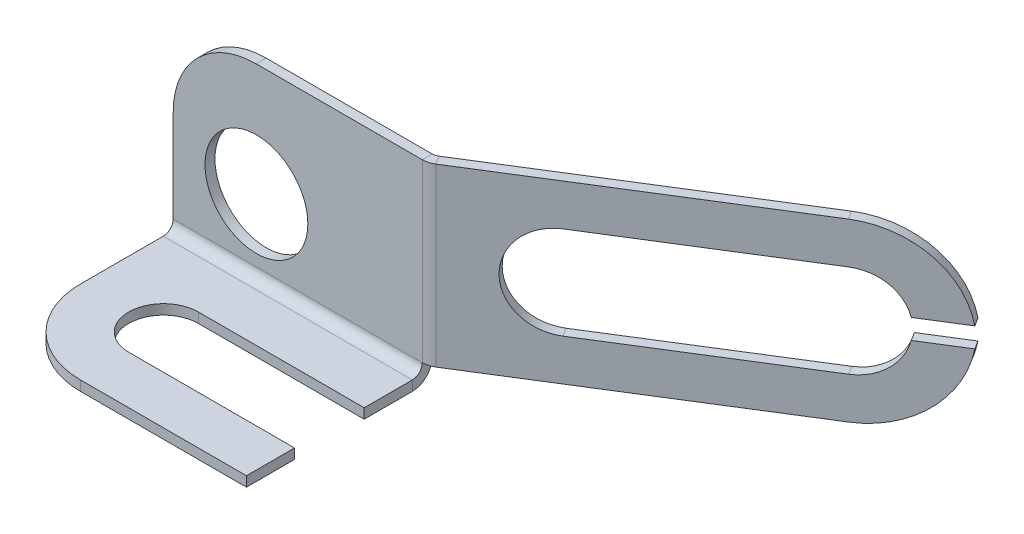
ISO-10303-21;
HEADER;
FILE_DESCRIPTION(('STEP AP214'),'2;1');
FILE_NAME('part.step','',(''),(''),'','','');
FILE_SCHEMA(('AUTOMOTIVE_DESIGN { 1 0 10303 214 1 1 1 1 }'));
ENDSEC;
DATA;
#1=APPLICATION_CONTEXT('core data for automotive mechanical design processes');
#2=APPLICATION_PROTOCOL_DEFINITION('international standard','automotive_design',2000,#1);
#3=PRODUCT_CONTEXT('',#1,'mechanical');
#4=PRODUCT('Part','Part','',(#3));
#5=PRODUCT_RELATED_PRODUCT_CATEGORY('part','',(#4));
#6=PRODUCT_DEFINITION_FORMATION('','',#4);
#7=PRODUCT_DEFINITION_CONTEXT('part definition',#1,'design');
#8=PRODUCT_DEFINITION('design','',#6,#7);
#9=PRODUCT_DEFINITION_SHAPE('','',#8);
#10=(LENGTH_UNIT() NAMED_UNIT(*) SI_UNIT(.MILLI.,.METRE.));
#11=(NAMED_UNIT(*) PLANE_ANGLE_UNIT() SI_UNIT($,.RADIAN.));
#12=(NAMED_UNIT(*) SI_UNIT($,.STERADIAN.) SOLID_ANGLE_UNIT());
#13=UNCERTAINTY_MEASURE_WITH_UNIT(LENGTH_MEASURE(1.E-05),#10,'distance_accuracy_value','');
#14=(GEOMETRIC_REPRESENTATION_CONTEXT(3) GLOBAL_UNCERTAINTY_ASSIGNED_CONTEXT((#13)) GLOBAL_UNIT_ASSIGNED_CONTEXT((#10,
#11,#12)) REPRESENTATION_CONTEXT('',''));
#15=CARTESIAN_POINT('',(0.,0.,0.));
#16=DIRECTION('',(0.,0.,1.));
#17=DIRECTION('',(1.,0.,0.));
#18=AXIS2_PLACEMENT_3D('',#15,#16,#17);
#19=CARTESIAN_POINT('',(17.1963563084559,5.9,-23.8353361754109));
#20=DIRECTION('',(0.5299192642332,0.,0.848048096156429));
#21=DIRECTION('',(0.848048096156429,0.,-0.5299192642332));
#22=AXIS2_PLACEMENT_3D('',#19,#20,#21);
#23=CYLINDRICAL_SURFACE('',#22,2.8);
#24=CARTESIAN_POINT('',(22.4955489507879,5.9,-15.3548552138466));
#25=DIRECTION('',(0.5299192642332,0.,0.848048096156429));
#26=DIRECTION('',(0.848048096156429,0.,-0.5299192642332));
#27=AXIS2_PLACEMENT_3D('',#24,#25,#26);
#28=CIRCLE('',#27,2.8);
#29=CARTESIAN_POINT('',(22.4955489507879,3.1,-15.3548552138466));
#30=VERTEX_POINT('',#29);
#31=CARTESIAN_POINT('',(24.8149256103651,5.3,-16.8041626039501));
#32=VERTEX_POINT('',#31);
#33=EDGE_CURVE('E284',#30,#32,#28,.T.);
#34=ORIENTED_EDGE('',*,*,#33,.T.);
#35=DIRECTION('',(0.5299192642332,0.,0.848048096156429));
#36=VECTOR('',#35,1.);
#37=CARTESIAN_POINT('',(19.5157329680331,5.3,-25.2846435655144));
#38=LINE('',#37,#36);
#39=CARTESIAN_POINT('',(24.4969740518252,5.3,-17.312991461644));
#40=VERTEX_POINT('',#39);
#41=EDGE_CURVE('E485',#40,#32,#38,.T.);
#42=ORIENTED_EDGE('',*,*,#41,.F.);
#43=CARTESIAN_POINT('',(22.177597392248,5.9,-15.8636840715404));
#44=DIRECTION('',(0.5299192642332,0.,0.848048096156429));
#45=DIRECTION('',(0.848048096156429,0.,-0.5299192642332));
#46=AXIS2_PLACEMENT_3D('',#43,#44,#45);
#47=CIRCLE('',#46,2.8);
#48=CARTESIAN_POINT('',(22.177597392248,3.1,-15.8636840715404));
#49=VERTEX_POINT('',#48);
#50=EDGE_CURVE('E462',#49,#40,#47,.T.);
#51=ORIENTED_EDGE('',*,*,#50,.F.);
#52=DIRECTION('',(0.5299192642332,0.,0.848048096156429));
#53=VECTOR('',#52,1.);
#54=CARTESIAN_POINT('',(17.1963563084559,3.1,-23.8353361754109));
#55=LINE('',#54,#53);
#56=EDGE_CURVE('E297',#49,#30,#55,.T.);
#57=ORIENTED_EDGE('',*,*,#56,.T.);
#58=EDGE_LOOP('',(#34,#42,#51,#57));
#59=FACE_BOUND('',#58,.T.);
#60=ADVANCED_FACE('F81',(#59),#23,.F.);
#61=CARTESIAN_POINT('',(27.2376716340272,11.2,-18.3180623415968));
#62=DIRECTION('',(0.,1.,0.));
#63=DIRECTION('',(0.,0.,1.));
#64=AXIS2_PLACEMENT_3D('',#61,#62,#63);
#65=PLANE('',#64);
#66=DIRECTION('',(0.848048096156429,0.,-0.5299192642332));
#67=VECTOR('',#66,1.);
#68=CARTESIAN_POINT('',(27.2376716340272,11.2,-18.3180623415968));
#69=LINE('',#68,#67);
#70=CARTESIAN_POINT('',(7.17632598044222,11.2,-5.78234228461228));
#71=VERTEX_POINT('',#70);
#72=CARTESIAN_POINT('',(22.4886022955512,11.2,-15.3505144618909));
#73=VERTEX_POINT('',#72);
#74=EDGE_CURVE('E304',#71,#73,#69,.T.);
#75=ORIENTED_EDGE('',*,*,#74,.T.);
#76=DIRECTION('',(0.5299192642332,0.,0.848048096156429));
#77=VECTOR('',#76,1.);
#78=CARTESIAN_POINT('',(17.1894096532192,11.2,-23.8309954234552));
#79=LINE('',#78,#77);
#80=CARTESIAN_POINT('',(22.1706507370113,11.2,-15.8593433195847));
#81=VERTEX_POINT('',#80);
#82=EDGE_CURVE('E272',#81,#73,#79,.T.);
#83=ORIENTED_EDGE('',*,*,#82,.F.);
#84=DIRECTION('',(-0.848048096156429,0.,0.5299192642332));
#85=VECTOR('',#84,1.);
#86=CARTESIAN_POINT('',(-0.777569215939798,11.2,-1.51970399011166));
#87=LINE('',#86,#85);
#88=CARTESIAN_POINT('',(6.8583744219023,11.2,-6.29117114230614));
#89=VERTEX_POINT('',#88);
#90=EDGE_CURVE('E308',#89,#81,#87,.F.);
#91=ORIENTED_EDGE('',*,*,#90,.F.);
#92=DIRECTION('',(0.5299192642332,0.,0.848048096156429));
#93=VECTOR('',#92,1.);
#94=CARTESIAN_POINT('',(7.17632598044221,11.2,-5.78234228461229));
#95=LINE('',#94,#93);
#96=EDGE_CURVE('E293',#89,#71,#95,.T.);
#97=ORIENTED_EDGE('',*,*,#96,.T.);
#98=EDGE_LOOP('',(#75,#83,#91,#97));
#99=FACE_BOUND('',#98,.T.);
#100=ADVANCED_FACE('F478',(#99),#65,.T.);
#101=CARTESIAN_POINT('',(-8.47418898798355,0.,-6.2));
#102=DIRECTION('',(-1.,0.,0.));
#103=DIRECTION('',(0.,-1.,0.));
#104=AXIS2_PLACEMENT_3D('',#101,#102,#103);
#105=PLANE('',#104);
#106=DIRECTION('',(0.,1.,0.));
#107=VECTOR('',#106,1.);
#108=CARTESIAN_POINT('',(-8.47418898798355,0.,-5.6));
#109=LINE('',#108,#107);
#110=CARTESIAN_POINT('',(-8.47418898798354,6.2,-5.6));
#111=VERTEX_POINT('',#110);
#112=CARTESIAN_POINT('',(-8.47418898798355,0.599999999999994,-5.6));
#113=VERTEX_POINT('',#112);
#114=EDGE_CURVE('E357',#111,#113,#109,.F.);
#115=ORIENTED_EDGE('',*,*,#114,.F.);
#116=DIRECTION('',(0.,0.,1.));
#117=VECTOR('',#116,1.);
#118=CARTESIAN_POINT('',(-8.47418898798354,6.2,-15.6));
#119=LINE('',#118,#117);
#120=CARTESIAN_POINT('',(-8.47418898798354,6.2,-6.2));
#121=VERTEX_POINT('',#120);
#122=EDGE_CURVE('E341',#121,#111,#119,.T.);
#123=ORIENTED_EDGE('',*,*,#122,.F.);
#124=DIRECTION('',(0.,-1.,0.));
#125=VECTOR('',#124,1.);
#126=CARTESIAN_POINT('',(-8.47418898798355,0.,-6.2));
#127=LINE('',#126,#125);
#128=CARTESIAN_POINT('',(-8.47418898798355,0.600000000000002,-6.2));
#129=VERTEX_POINT('',#128);
#130=EDGE_CURVE('E350',#121,#129,#127,.T.);
#131=ORIENTED_EDGE('',*,*,#130,.T.);
#132=DIRECTION('',(0.,0.,-1.));
#133=VECTOR('',#132,1.);
#134=CARTESIAN_POINT('',(-8.47418898798355,0.599999999999998,-5.6));
#135=LINE('',#134,#133);
#136=EDGE_CURVE('E368',#113,#129,#135,.T.);
#137=ORIENTED_EDGE('',*,*,#136,.F.);
#138=EDGE_LOOP('',(#115,#123,#131,#137));
#139=FACE_BOUND('',#138,.T.);
#140=ADVANCED_FACE('F546',(#139),#105,.T.);
#141=CARTESIAN_POINT('',(6.54042286336237,-0.6,-5.));
#142=DIRECTION('',(1.,0.,0.));
#143=DIRECTION('',(0.,0.,-1.));
#144=AXIS2_PLACEMENT_3D('',#141,#142,#143);
#145=PLANE('',#144);
#146=DIRECTION('',(0.,1.,0.));
#147=VECTOR('',#146,1.);
#148=CARTESIAN_POINT('',(6.54042286336238,-10.,2.1));
#149=LINE('',#148,#147);
#150=CARTESIAN_POINT('',(6.54042286336238,-0.6,2.1));
#151=VERTEX_POINT('',#150);
#152=CARTESIAN_POINT('',(6.54042286336238,0.,2.1));
#153=VERTEX_POINT('',#152);
#154=EDGE_CURVE('E395',#151,#153,#149,.T.);
#155=ORIENTED_EDGE('',*,*,#154,.T.);
#156=DIRECTION('',(0.,0.,-1.));
#157=VECTOR('',#156,1.);
#158=CARTESIAN_POINT('',(6.54042286336237,0.,-5.));
#159=LINE('',#158,#157);
#160=CARTESIAN_POINT('',(6.54042286336238,0.,5.));
#161=VERTEX_POINT('',#160);
#162=EDGE_CURVE('E430',#161,#153,#159,.T.);
#163=ORIENTED_EDGE('',*,*,#162,.F.);
#164=DIRECTION('',(0.,1.,0.));
#165=VECTOR('',#164,1.);
#166=CARTESIAN_POINT('',(6.54042286336238,-0.6,5.));
#167=LINE('',#166,#165);
#168=CARTESIAN_POINT('',(6.54042286336238,-0.6,5.));
#169=VERTEX_POINT('',#168);
#170=EDGE_CURVE('E445',#169,#161,#167,.T.);
#171=ORIENTED_EDGE('',*,*,#170,.F.);
#172=DIRECTION('',(0.,0.,-1.));
#173=VECTOR('',#172,1.);
#174=CARTESIAN_POINT('',(6.54042286336237,-0.6,-5.));
#175=LINE('',#174,#173);
#176=EDGE_CURVE('E413',#169,#151,#175,.T.);
#177=ORIENTED_EDGE('',*,*,#176,.T.);
#178=EDGE_LOOP('',(#155,#163,#171,#177));
#179=FACE_BOUND('',#178,.T.);
#180=ADVANCED_FACE('F581',(#179),#145,.T.);
#181=DIRECTION('',(0.,1.,0.));
#182=VECTOR('',#181,1.);
#183=CARTESIAN_POINT('',(6.54042286336238,-10.,-2.1));
#184=LINE('',#183,#182);
#185=CARTESIAN_POINT('',(6.54042286336238,-0.6,-2.1));
#186=VERTEX_POINT('',#185);
#187=CARTESIAN_POINT('',(6.54042286336238,0.,-2.1));
#188=VERTEX_POINT('',#187);
#189=EDGE_CURVE('E394',#186,#188,#184,.T.);
#190=ORIENTED_EDGE('',*,*,#189,.F.);
#191=CARTESIAN_POINT('',(6.54042286336237,-0.6,-5.));
#192=VERTEX_POINT('',#191);
#193=EDGE_CURVE('E417',#186,#192,#175,.T.);
#194=ORIENTED_EDGE('',*,*,#193,.T.);
#195=DIRECTION('',(0.,1.,0.));
#196=VECTOR('',#195,1.);
#197=CARTESIAN_POINT('',(6.54042286336237,-0.6,-5.));
#198=LINE('',#197,#196);
#199=CARTESIAN_POINT('',(6.54042286336237,0.,-5.));
#200=VERTEX_POINT('',#199);
#201=EDGE_CURVE('E429',#192,#200,#198,.T.);
#202=ORIENTED_EDGE('',*,*,#201,.T.);
#203=EDGE_CURVE('E412',#188,#200,#159,.T.);
#204=ORIENTED_EDGE('',*,*,#203,.F.);
#205=EDGE_LOOP('',(#190,#194,#202,#204));
#206=FACE_BOUND('',#205,.T.);
#207=ADVANCED_FACE('F83',(#206),#145,.T.);
#208=CARTESIAN_POINT('',(-3.47418898798355,-0.6,5.));
#209=DIRECTION('',(0.,0.,1.));
#210=DIRECTION('',(1.,0.,0.));
#211=AXIS2_PLACEMENT_3D('',#208,#209,#210);
#212=PLANE('',#211);
#213=DIRECTION('',(1.,0.,0.));
#214=VECTOR('',#213,1.);
#215=CARTESIAN_POINT('',(-3.47418898798355,0.,5.));
#216=LINE('',#215,#214);
#217=CARTESIAN_POINT('',(-3.47418898798355,0.,5.));
#218=VERTEX_POINT('',#217);
#219=EDGE_CURVE('E442',#218,#161,#216,.T.);
#220=ORIENTED_EDGE('',*,*,#219,.F.);
#221=DIRECTION('',(0.,1.,0.));
#222=VECTOR('',#221,1.);
#223=CARTESIAN_POINT('',(-3.47418898798355,-0.6,5.));
#224=LINE('',#223,#222);
#225=CARTESIAN_POINT('',(-3.47418898798355,-0.6,5.));
#226=VERTEX_POINT('',#225);
#227=EDGE_CURVE('E448',#226,#218,#224,.T.);
#228=ORIENTED_EDGE('',*,*,#227,.F.);
#229=DIRECTION('',(1.,0.,0.));
#230=VECTOR('',#229,1.);
#231=CARTESIAN_POINT('',(-3.47418898798355,-0.6,5.));
#232=LINE('',#231,#230);
#233=EDGE_CURVE('E426',#226,#169,#232,.T.);
#234=ORIENTED_EDGE('',*,*,#233,.T.);
#235=ORIENTED_EDGE('',*,*,#170,.T.);
#236=EDGE_LOOP('',(#220,#228,#234,#235));
#237=FACE_BOUND('',#236,.T.);
#238=ADVANCED_FACE('F585',(#237),#212,.T.);
#239=CARTESIAN_POINT('',(-3.47418898798355,-0.6,0.));
#240=DIRECTION('',(0.,1.,0.));
#241=DIRECTION('',(0.,0.,1.));
#242=AXIS2_PLACEMENT_3D('',#239,#240,#241);
#243=CYLINDRICAL_SURFACE('',#242,5.);
#244=CARTESIAN_POINT('',(-3.47418898798355,0.,0.));
#245=DIRECTION('',(0.,1.,0.));
#246=DIRECTION('',(0.,0.,1.));
#247=AXIS2_PLACEMENT_3D('',#244,#245,#246);
#248=CIRCLE('',#247,5.);
#249=CARTESIAN_POINT('',(-8.47418898798354,0.,0.));
#250=VERTEX_POINT('',#249);
#251=EDGE_CURVE('E439',#250,#218,#248,.T.);
#252=ORIENTED_EDGE('',*,*,#251,.F.);
#253=DIRECTION('',(0.,1.,0.));
#254=VECTOR('',#253,1.);
#255=CARTESIAN_POINT('',(-8.47418898798354,-0.6,0.));
#256=LINE('',#255,#254);
#257=CARTESIAN_POINT('',(-8.47418898798354,-0.6,0.));
#258=VERTEX_POINT('',#257);
#259=EDGE_CURVE('E450',#258,#250,#256,.T.);
#260=ORIENTED_EDGE('',*,*,#259,.F.);
#261=CARTESIAN_POINT('',(-3.47418898798355,-0.6,0.));
#262=DIRECTION('',(0.,1.,0.));
#263=DIRECTION('',(0.,0.,1.));
#264=AXIS2_PLACEMENT_3D('',#261,#262,#263);
#265=CIRCLE('',#264,5.);
#266=EDGE_CURVE('E423',#258,#226,#265,.T.);
#267=ORIENTED_EDGE('',*,*,#266,.T.);
#268=ORIENTED_EDGE('',*,*,#227,.T.);
#269=EDGE_LOOP('',(#252,#260,#267,#268));
#270=FACE_BOUND('',#269,.T.);
#271=ADVANCED_FACE('F590',(#270),#243,.T.);
#272=CARTESIAN_POINT('',(-8.47418898798355,-0.6,-5.));
#273=DIRECTION('',(-1.,0.,0.));
#274=DIRECTION('',(0.,0.,1.));
#275=AXIS2_PLACEMENT_3D('',#272,#273,#274);
#276=PLANE('',#275);
#277=DIRECTION('',(0.,0.,1.));
#278=VECTOR('',#277,1.);
#279=CARTESIAN_POINT('',(-8.47418898798355,0.,-5.));
#280=LINE('',#279,#278);
#281=CARTESIAN_POINT('',(-8.47418898798355,0.,-5.));
#282=VERTEX_POINT('',#281);
#283=EDGE_CURVE('E436',#282,#250,#280,.T.);
#284=ORIENTED_EDGE('',*,*,#283,.F.);
#285=DIRECTION('',(0.,1.,0.));
#286=VECTOR('',#285,1.);
#287=CARTESIAN_POINT('',(-8.47418898798355,-0.6,-5.));
#288=LINE('',#287,#286);
#289=CARTESIAN_POINT('',(-8.47418898798355,-0.600000000000004,-5.));
#290=VERTEX_POINT('',#289);
#291=EDGE_CURVE('E452',#290,#282,#288,.T.);
#292=ORIENTED_EDGE('',*,*,#291,.F.);
#293=DIRECTION('',(0.,0.,1.));
#294=VECTOR('',#293,1.);
#295=CARTESIAN_POINT('',(-8.47418898798355,-0.6,-5.));
#296=LINE('',#295,#294);
#297=EDGE_CURVE('E420',#290,#258,#296,.T.);
#298=ORIENTED_EDGE('',*,*,#297,.T.);
#299=ORIENTED_EDGE('',*,*,#259,.T.);
#300=EDGE_LOOP('',(#284,#292,#298,#299));
#301=FACE_BOUND('',#300,.T.);
#302=ADVANCED_FACE('F588',(#301),#276,.T.);
#303=CARTESIAN_POINT('',(-3.47418898798355,-0.6,0.));
#304=DIRECTION('',(0.,1.,0.));
#305=DIRECTION('',(0.,0.,1.));
#306=AXIS2_PLACEMENT_3D('',#303,#304,#305);
#307=PLANE('',#306);
#308=CARTESIAN_POINT('',(-3.45957713663762,-0.6,0.));
#309=DIRECTION('',(0.,1.,0.));
#310=DIRECTION('',(0.,0.,1.));
#311=AXIS2_PLACEMENT_3D('',#308,#309,#310);
#312=CIRCLE('',#311,2.1);
#313=CARTESIAN_POINT('',(-3.45957713663762,-0.6,-2.1));
#314=VERTEX_POINT('',#313);
#315=CARTESIAN_POINT('',(-3.45957713663762,-0.6,2.1));
#316=VERTEX_POINT('',#315);
#317=EDGE_CURVE('E406',#314,#316,#312,.T.);
#318=ORIENTED_EDGE('',*,*,#317,.T.);
#319=DIRECTION('',(1.,0.,0.));
#320=VECTOR('',#319,1.);
#321=CARTESIAN_POINT('',(-3.47418898798355,-0.6,2.1));
#322=LINE('',#321,#320);
#323=EDGE_CURVE('E409',#316,#151,#322,.T.);
#324=ORIENTED_EDGE('',*,*,#323,.T.);
#325=ORIENTED_EDGE('',*,*,#176,.F.);
#326=ORIENTED_EDGE('',*,*,#233,.F.);
#327=ORIENTED_EDGE('',*,*,#266,.F.);
#328=ORIENTED_EDGE('',*,*,#297,.F.);
#329=DIRECTION('',(-1.,0.,0.));
#330=VECTOR('',#329,1.);
#331=CARTESIAN_POINT('',(-8.47418898798355,-0.6,-5.));
#332=LINE('',#331,#330);
#333=EDGE_CURVE('E416',#192,#290,#332,.T.);
#334=ORIENTED_EDGE('',*,*,#333,.F.);
#335=ORIENTED_EDGE('',*,*,#193,.F.);
#336=DIRECTION('',(-1.,0.,0.));
#337=VECTOR('',#336,1.);
#338=CARTESIAN_POINT('',(-3.47418898798355,-0.6,-2.1));
#339=LINE('',#338,#337);
#340=EDGE_CURVE('E398',#186,#314,#339,.T.);
#341=ORIENTED_EDGE('',*,*,#340,.T.);
#342=EDGE_LOOP('',(#318,#324,#325,#326,#327,#328,#334,#335,#341));
#343=FACE_BOUND('',#342,.T.);
#344=ADVANCED_FACE('F560',(#343),#307,.F.);
#345=CARTESIAN_POINT('',(-3.47418898798355,0.,0.));
#346=DIRECTION('',(0.,1.,0.));
#347=DIRECTION('',(0.,0.,1.));
#348=AXIS2_PLACEMENT_3D('',#345,#346,#347);
#349=PLANE('',#348);
#350=DIRECTION('',(1.,0.,0.));
#351=VECTOR('',#350,1.);
#352=CARTESIAN_POINT('',(6.54042286336238,0.,2.1));
#353=LINE('',#352,#351);
#354=CARTESIAN_POINT('',(-3.45957713663762,0.,2.1));
#355=VERTEX_POINT('',#354);
#356=EDGE_CURVE('E392',#355,#153,#353,.T.);
#357=ORIENTED_EDGE('',*,*,#356,.F.);
#358=CARTESIAN_POINT('',(-3.45957713663762,0.,0.));
#359=DIRECTION('',(0.,1.,0.));
#360=DIRECTION('',(0.,0.,1.));
#361=AXIS2_PLACEMENT_3D('',#358,#359,#360);
#362=CIRCLE('',#361,2.1);
#363=CARTESIAN_POINT('',(-3.45957713663762,0.,-2.1));
#364=VERTEX_POINT('',#363);
#365=EDGE_CURVE('E389',#364,#355,#362,.T.);
#366=ORIENTED_EDGE('',*,*,#365,.F.);
#367=DIRECTION('',(-1.,0.,0.));
#368=VECTOR('',#367,1.);
#369=CARTESIAN_POINT('',(6.54042286336238,0.,-2.1));
#370=LINE('',#369,#368);
#371=EDGE_CURVE('E378',#188,#364,#370,.T.);
#372=ORIENTED_EDGE('',*,*,#371,.F.);
#373=ORIENTED_EDGE('',*,*,#203,.T.);
#374=DIRECTION('',(-1.,0.,0.));
#375=VECTOR('',#374,1.);
#376=CARTESIAN_POINT('',(-8.47418898798355,0.,-5.));
#377=LINE('',#376,#375);
#378=EDGE_CURVE('E433',#200,#282,#377,.T.);
#379=ORIENTED_EDGE('',*,*,#378,.T.);
#380=ORIENTED_EDGE('',*,*,#283,.T.);
#381=ORIENTED_EDGE('',*,*,#251,.T.);
#382=ORIENTED_EDGE('',*,*,#219,.T.);
#383=ORIENTED_EDGE('',*,*,#162,.T.);
#384=EDGE_LOOP('',(#357,#366,#372,#373,#379,#380,#381,#382,#383));
#385=FACE_BOUND('',#384,.T.);
#386=ADVANCED_FACE('F573',(#385),#349,.T.);
#387=CARTESIAN_POINT('',(6.54042286336238,-10.,2.1));
#388=DIRECTION('',(0.,0.,1.));
#389=DIRECTION('',(1.,0.,0.));
#390=AXIS2_PLACEMENT_3D('',#387,#388,#389);
#391=PLANE('',#390);
#392=DIRECTION('',(0.,1.,0.));
#393=VECTOR('',#392,1.);
#394=CARTESIAN_POINT('',(-3.45957713663762,-10.,2.1));
#395=LINE('',#394,#393);
#396=EDGE_CURVE('E399',#316,#355,#395,.T.);
#397=ORIENTED_EDGE('',*,*,#396,.T.);
#398=ORIENTED_EDGE('',*,*,#356,.T.);
#399=ORIENTED_EDGE('',*,*,#154,.F.);
#400=ORIENTED_EDGE('',*,*,#323,.F.);
#401=EDGE_LOOP('',(#397,#398,#399,#400));
#402=FACE_BOUND('',#401,.T.);
#403=ADVANCED_FACE('F901',(#402),#391,.F.);
#404=CARTESIAN_POINT('',(-3.45957713663762,-10.,0.));
#405=DIRECTION('',(0.,1.,0.));
#406=DIRECTION('',(0.,0.,1.));
#407=AXIS2_PLACEMENT_3D('',#404,#405,#406);
#408=CYLINDRICAL_SURFACE('',#407,2.1);
#409=DIRECTION('',(0.,1.,0.));
#410=VECTOR('',#409,1.);
#411=CARTESIAN_POINT('',(-3.45957713663762,-10.,-2.1));
#412=LINE('',#411,#410);
#413=EDGE_CURVE('E401',#314,#364,#412,.T.);
#414=ORIENTED_EDGE('',*,*,#413,.T.);
#415=ORIENTED_EDGE('',*,*,#365,.T.);
#416=ORIENTED_EDGE('',*,*,#396,.F.);
#417=ORIENTED_EDGE('',*,*,#317,.F.);
#418=EDGE_LOOP('',(#414,#415,#416,#417));
#419=FACE_BOUND('',#418,.T.);
#420=ADVANCED_FACE('F576',(#419),#408,.F.);
#421=CARTESIAN_POINT('',(6.54042286336238,-10.,-2.1));
#422=DIRECTION('',(0.,0.,-1.));
#423=DIRECTION('',(-1.,0.,0.));
#424=AXIS2_PLACEMENT_3D('',#421,#422,#423);
#425=PLANE('',#424);
#426=ORIENTED_EDGE('',*,*,#189,.T.);
#427=ORIENTED_EDGE('',*,*,#371,.T.);
#428=ORIENTED_EDGE('',*,*,#413,.F.);
#429=ORIENTED_EDGE('',*,*,#340,.F.);
#430=EDGE_LOOP('',(#426,#427,#428,#429));
#431=FACE_BOUND('',#430,.T.);
#432=ADVANCED_FACE('F568',(#431),#425,.F.);
#433=CARTESIAN_POINT('',(6.54042286336237,0.599999999999994,-5.));
#434=DIRECTION('',(1.,0.,0.));
#435=DIRECTION('',(0.,0.,-1.));
#436=AXIS2_PLACEMENT_3D('',#433,#434,#435);
#437=PLANE('',#436);
#438=DIRECTION('',(0.,0.,-1.));
#439=VECTOR('',#438,1.);
#440=CARTESIAN_POINT('',(6.54042286336237,0.600000000000002,-6.20000000000007));
#441=LINE('',#440,#439);
#442=CARTESIAN_POINT('',(6.54042286336237,0.599999999999993,-5.6));
#443=VERTEX_POINT('',#442);
#444=CARTESIAN_POINT('',(6.54042286336237,0.599999999999993,-6.2));
#445=VERTEX_POINT('',#444);
#446=EDGE_CURVE('E345',#443,#445,#441,.T.);
#447=ORIENTED_EDGE('',*,*,#446,.F.);
#448=CARTESIAN_POINT('',(6.54042286336237,0.599999999999994,-5.));
#449=DIRECTION('',(-1.,0.,0.));
#450=DIRECTION('',(0.,0.,1.));
#451=AXIS2_PLACEMENT_3D('',#448,#449,#450);
#452=CIRCLE('',#451,0.599999999999998);
#453=EDGE_CURVE('E382',#200,#443,#452,.F.);
#454=ORIENTED_EDGE('',*,*,#453,.F.);
#455=ORIENTED_EDGE('',*,*,#201,.F.);
#456=CARTESIAN_POINT('',(6.54042286336237,0.599999999999994,-5.));
#457=DIRECTION('',(-1.,0.,0.));
#458=DIRECTION('',(0.,0.,1.));
#459=AXIS2_PLACEMENT_3D('',#456,#457,#458);
#460=CIRCLE('',#459,1.2);
#461=EDGE_CURVE('E375',#192,#445,#460,.F.);
#462=ORIENTED_EDGE('',*,*,#461,.T.);
#463=EDGE_LOOP('',(#447,#454,#455,#462));
#464=FACE_BOUND('',#463,.T.);
#465=ADVANCED_FACE('F529',(#464),#437,.T.);
#466=CARTESIAN_POINT('',(-8.47418898798355,0.599999999999994,-5.));
#467=DIRECTION('',(1.,0.,0.));
#468=DIRECTION('',(0.,0.,-1.));
#469=AXIS2_PLACEMENT_3D('',#466,#467,#468);
#470=PLANE('',#469);
#471=CARTESIAN_POINT('',(-8.47418898798355,0.599999999999994,-5.));
#472=DIRECTION('',(-1.,0.,0.));
#473=DIRECTION('',(0.,0.,1.));
#474=AXIS2_PLACEMENT_3D('',#471,#472,#473);
#475=CIRCLE('',#474,0.599999999999998);
#476=EDGE_CURVE('E349',#113,#282,#475,.T.);
#477=ORIENTED_EDGE('',*,*,#476,.F.);
#478=ORIENTED_EDGE('',*,*,#136,.T.);
#479=CARTESIAN_POINT('',(-8.47418898798355,0.599999999999994,-5.));
#480=DIRECTION('',(-1.,0.,0.));
#481=DIRECTION('',(0.,0.,1.));
#482=AXIS2_PLACEMENT_3D('',#479,#480,#481);
#483=CIRCLE('',#482,1.2);
#484=EDGE_CURVE('E379',#129,#290,#483,.T.);
#485=ORIENTED_EDGE('',*,*,#484,.T.);
#486=ORIENTED_EDGE('',*,*,#291,.T.);
#487=EDGE_LOOP('',(#477,#478,#485,#486));
#488=FACE_BOUND('',#487,.T.);
#489=ADVANCED_FACE('F550',(#488),#470,.F.);
#490=CARTESIAN_POINT('',(-8.47418898798355,0.599999999999994,-5.));
#491=DIRECTION('',(-1.,0.,0.));
#492=DIRECTION('',(0.,0.,-1.));
#493=AXIS2_PLACEMENT_3D('',#490,#491,#492);
#494=CYLINDRICAL_SURFACE('',#493,1.2);
#495=ORIENTED_EDGE('',*,*,#333,.T.);
#496=ORIENTED_EDGE('',*,*,#484,.F.);
#497=DIRECTION('',(-1.,0.,0.));
#498=VECTOR('',#497,1.);
#499=CARTESIAN_POINT('',(0.,0.600000000000002,-6.2));
#500=LINE('',#499,#498);
#501=EDGE_CURVE('E365',#445,#129,#500,.T.);
#502=ORIENTED_EDGE('',*,*,#501,.F.);
#503=ORIENTED_EDGE('',*,*,#461,.F.);
#504=EDGE_LOOP('',(#495,#496,#502,#503));
#505=FACE_BOUND('',#504,.T.);
#506=ADVANCED_FACE('F556',(#505),#494,.T.);
#507=CARTESIAN_POINT('',(-8.47418898798355,0.599999999999994,-5.));
#508=DIRECTION('',(-1.,0.,0.));
#509=DIRECTION('',(0.,0.,-1.));
#510=AXIS2_PLACEMENT_3D('',#507,#508,#509);
#511=CYLINDRICAL_SURFACE('',#510,0.599999999999998);
#512=ORIENTED_EDGE('',*,*,#378,.F.);
#513=ORIENTED_EDGE('',*,*,#453,.T.);
#514=DIRECTION('',(1.,0.,0.));
#515=VECTOR('',#514,1.);
#516=CARTESIAN_POINT('',(6.54042286336238,0.599999999999998,-5.6));
#517=LINE('',#516,#515);
#518=EDGE_CURVE('E371',#443,#113,#517,.F.);
#519=ORIENTED_EDGE('',*,*,#518,.T.);
#520=ORIENTED_EDGE('',*,*,#476,.T.);
#521=EDGE_LOOP('',(#512,#513,#519,#520));
#522=FACE_BOUND('',#521,.T.);
#523=ADVANCED_FACE('F536',(#522),#511,.F.);
#524=CARTESIAN_POINT('',(0.,0.,-6.2));
#525=DIRECTION('',(0.,0.,-1.));
#526=DIRECTION('',(-1.,0.,0.));
#527=AXIS2_PLACEMENT_3D('',#524,#525,#526);
#528=PLANE('',#527);
#529=CARTESIAN_POINT('',(-3.45957713663763,4.4,-6.2));
#530=DIRECTION('',(0.,0.,-1.));
#531=DIRECTION('',(-1.,0.,0.));
#532=AXIS2_PLACEMENT_3D('',#529,#530,#531);
#533=CIRCLE('',#532,3.1);
#534=CARTESIAN_POINT('',(-6.55957713663763,4.4,-6.2));
#535=VERTEX_POINT('',#534);
#536=EDGE_CURVE('E336',#535,#535,#533,.T.);
#537=ORIENTED_EDGE('',*,*,#536,.F.);
#538=EDGE_LOOP('',(#537));
#539=FACE_BOUND('',#538,.T.);
#540=CARTESIAN_POINT('',(-3.47418898798354,6.2,-6.2));
#541=DIRECTION('',(0.,0.,-1.));
#542=DIRECTION('',(-1.,0.,0.));
#543=AXIS2_PLACEMENT_3D('',#540,#541,#542);
#544=CIRCLE('',#543,5.);
#545=CARTESIAN_POINT('',(-3.47418898798354,11.2,-6.2));
#546=VERTEX_POINT('',#545);
#547=EDGE_CURVE('E343',#546,#121,#544,.F.);
#548=ORIENTED_EDGE('',*,*,#547,.F.);
#549=DIRECTION('',(-1.,0.,0.));
#550=VECTOR('',#549,1.);
#551=CARTESIAN_POINT('',(-8.47418898798354,11.2,-6.2));
#552=LINE('',#551,#550);
#553=CARTESIAN_POINT('',(6.54042286336237,11.2,-6.2));
#554=VERTEX_POINT('',#553);
#555=EDGE_CURVE('E352',#554,#546,#552,.T.);
#556=ORIENTED_EDGE('',*,*,#555,.F.);
#557=DIRECTION('',(0.,1.,0.));
#558=VECTOR('',#557,1.);
#559=CARTESIAN_POINT('',(6.54042286336238,11.2,-6.2));
#560=LINE('',#559,#558);
#561=EDGE_CURVE('E355',#445,#554,#560,.T.);
#562=ORIENTED_EDGE('',*,*,#561,.F.);
#563=ORIENTED_EDGE('',*,*,#501,.T.);
#564=ORIENTED_EDGE('',*,*,#130,.F.);
#565=EDGE_LOOP('',(#548,#556,#562,#563,#564));
#566=FACE_BOUND('',#565,.T.);
#567=ADVANCED_FACE('F553',(#539,#566),#528,.T.);
#568=CARTESIAN_POINT('',(0.,0.,-5.6));
#569=DIRECTION('',(0.,0.,-1.));
#570=DIRECTION('',(-1.,0.,0.));
#571=AXIS2_PLACEMENT_3D('',#568,#569,#570);
#572=PLANE('',#571);
#573=CARTESIAN_POINT('',(-3.45957713663763,4.4,-5.6));
#574=DIRECTION('',(0.,0.,1.));
#575=DIRECTION('',(1.,0.,0.));
#576=AXIS2_PLACEMENT_3D('',#573,#574,#575);
#577=CIRCLE('',#576,3.1);
#578=CARTESIAN_POINT('',(-0.359577136637625,4.4,-5.6));
#579=VERTEX_POINT('',#578);
#580=EDGE_CURVE('E325',#579,#579,#577,.T.);
#581=ORIENTED_EDGE('',*,*,#580,.F.);
#582=EDGE_LOOP('',(#581));
#583=FACE_BOUND('',#582,.T.);
#584=DIRECTION('',(1.,0.,0.));
#585=VECTOR('',#584,1.);
#586=CARTESIAN_POINT('',(0.,11.2,-5.6));
#587=LINE('',#586,#585);
#588=CARTESIAN_POINT('',(6.54042286336238,11.2,-5.6));
#589=VERTEX_POINT('',#588);
#590=CARTESIAN_POINT('',(-3.47418898798354,11.2,-5.6));
#591=VERTEX_POINT('',#590);
#592=EDGE_CURVE('E359',#589,#591,#587,.F.);
#593=ORIENTED_EDGE('',*,*,#592,.T.);
#594=CARTESIAN_POINT('',(-3.47418898798354,6.2,-5.6));
#595=DIRECTION('',(0.,0.,-1.));
#596=DIRECTION('',(-1.,0.,0.));
#597=AXIS2_PLACEMENT_3D('',#594,#595,#596);
#598=CIRCLE('',#597,5.);
#599=EDGE_CURVE('E339',#111,#591,#598,.T.);
#600=ORIENTED_EDGE('',*,*,#599,.F.);
#601=ORIENTED_EDGE('',*,*,#114,.T.);
#602=ORIENTED_EDGE('',*,*,#518,.F.);
#603=DIRECTION('',(0.,-1.,0.));
#604=VECTOR('',#603,1.);
#605=CARTESIAN_POINT('',(6.54042286336237,0.,-5.6));
#606=LINE('',#605,#604);
#607=EDGE_CURVE('E362',#443,#589,#606,.F.);
#608=ORIENTED_EDGE('',*,*,#607,.T.);
#609=EDGE_LOOP('',(#593,#600,#601,#602,#608));
#610=FACE_BOUND('',#609,.T.);
#611=ADVANCED_FACE('F539',(#583,#610),#572,.F.);
#612=CARTESIAN_POINT('',(-8.47418898798354,11.2,-6.2));
#613=DIRECTION('',(0.,1.,0.));
#614=DIRECTION('',(0.,0.,1.));
#615=AXIS2_PLACEMENT_3D('',#612,#613,#614);
#616=PLANE('',#615);
#617=DIRECTION('',(0.,0.,1.));
#618=VECTOR('',#617,1.);
#619=CARTESIAN_POINT('',(-3.47418898798354,11.2,-15.6));
#620=LINE('',#619,#618);
#621=EDGE_CURVE('E447',#591,#546,#620,.F.);
#622=ORIENTED_EDGE('',*,*,#621,.F.);
#623=ORIENTED_EDGE('',*,*,#592,.F.);
#624=DIRECTION('',(0.,0.,1.));
#625=VECTOR('',#624,1.);
#626=CARTESIAN_POINT('',(6.54042286336238,11.2,-6.2));
#627=LINE('',#626,#625);
#628=EDGE_CURVE('E346',#554,#589,#627,.T.);
#629=ORIENTED_EDGE('',*,*,#628,.F.);
#630=ORIENTED_EDGE('',*,*,#555,.T.);
#631=EDGE_LOOP('',(#622,#623,#629,#630));
#632=FACE_BOUND('',#631,.T.);
#633=ADVANCED_FACE('F797',(#632),#616,.T.);
#634=CARTESIAN_POINT('',(-3.47418898798354,6.2,-15.6));
#635=DIRECTION('',(0.,0.,1.));
#636=DIRECTION('',(1.,0.,0.));
#637=AXIS2_PLACEMENT_3D('',#634,#635,#636);
#638=CYLINDRICAL_SURFACE('',#637,5.);
#639=ORIENTED_EDGE('',*,*,#547,.T.);
#640=ORIENTED_EDGE('',*,*,#122,.T.);
#641=ORIENTED_EDGE('',*,*,#599,.T.);
#642=ORIENTED_EDGE('',*,*,#621,.T.);
#643=EDGE_LOOP('',(#639,#640,#641,#642));
#644=FACE_BOUND('',#643,.T.);
#645=ADVANCED_FACE('F784',(#644),#638,.T.);
#646=CARTESIAN_POINT('',(-3.45957713663763,4.4,-15.6));
#647=DIRECTION('',(0.,0.,1.));
#648=DIRECTION('',(1.,0.,0.));
#649=AXIS2_PLACEMENT_3D('',#646,#647,#648);
#650=CYLINDRICAL_SURFACE('',#649,3.1);
#651=ORIENTED_EDGE('',*,*,#536,.T.);
#652=EDGE_LOOP('',(#651));
#653=FACE_BOUND('',#652,.T.);
#654=ORIENTED_EDGE('',*,*,#580,.T.);
#655=EDGE_LOOP('',(#654));
#656=FACE_BOUND('',#655,.T.);
#657=ADVANCED_FACE('F771',(#653,#656),#650,.F.);
#658=CARTESIAN_POINT('',(6.54042286336238,11.2,-6.8));
#659=DIRECTION('',(0.,1.,0.));
#660=DIRECTION('',(0.,0.,1.));
#661=AXIS2_PLACEMENT_3D('',#658,#659,#660);
#662=PLANE('',#661);
#663=ORIENTED_EDGE('',*,*,#96,.F.);
#664=CARTESIAN_POINT('',(6.54042286336238,11.2,-6.8));
#665=DIRECTION('',(0.,-1.,0.));
#666=DIRECTION('',(0.,0.,-1.));
#667=AXIS2_PLACEMENT_3D('',#664,#665,#666);
#668=CIRCLE('',#667,0.600000000000002);
#669=EDGE_CURVE('E329',#554,#89,#668,.F.);
#670=ORIENTED_EDGE('',*,*,#669,.F.);
#671=ORIENTED_EDGE('',*,*,#628,.T.);
#672=CARTESIAN_POINT('',(6.54042286336238,11.2,-6.8));
#673=DIRECTION('',(0.,-1.,0.));
#674=DIRECTION('',(0.,0.,-1.));
#675=AXIS2_PLACEMENT_3D('',#672,#673,#674);
#676=CIRCLE('',#675,1.2);
#677=EDGE_CURVE('E322',#589,#71,#676,.F.);
#678=ORIENTED_EDGE('',*,*,#677,.T.);
#679=EDGE_LOOP('',(#663,#670,#671,#678));
#680=FACE_BOUND('',#679,.T.);
#681=ADVANCED_FACE('F760',(#680),#662,.T.);
#682=CARTESIAN_POINT('',(6.54042286336238,0.599999999999993,-6.80000000000001));
#683=DIRECTION('',(0.,1.,0.));
#684=DIRECTION('',(0.,0.,1.));
#685=AXIS2_PLACEMENT_3D('',#682,#683,#684);
#686=PLANE('',#685);
#687=CARTESIAN_POINT('',(6.54042286336238,0.599999999999993,-6.80000000000001));
#688=DIRECTION('',(0.,-1.,0.));
#689=DIRECTION('',(0.,0.,-1.));
#690=AXIS2_PLACEMENT_3D('',#687,#688,#689);
#691=CIRCLE('',#690,0.600000000000002);
#692=CARTESIAN_POINT('',(6.8583744219023,0.599999999999993,-6.29117114230615));
#693=VERTEX_POINT('',#692);
#694=EDGE_CURVE('E303',#693,#445,#691,.T.);
#695=ORIENTED_EDGE('',*,*,#694,.F.);
#696=DIRECTION('',(0.5299192642332,0.,0.848048096156429));
#697=VECTOR('',#696,1.);
#698=CARTESIAN_POINT('',(6.8583744219023,0.599999999999993,-6.29117114230614));
#699=LINE('',#698,#697);
#700=CARTESIAN_POINT('',(7.17632598044222,0.599999999999993,-5.78234228461229));
#701=VERTEX_POINT('',#700);
#702=EDGE_CURVE('E314',#693,#701,#699,.T.);
#703=ORIENTED_EDGE('',*,*,#702,.T.);
#704=CARTESIAN_POINT('',(6.54042286336238,0.599999999999993,-6.80000000000001));
#705=DIRECTION('',(0.,-1.,0.));
#706=DIRECTION('',(0.,0.,-1.));
#707=AXIS2_PLACEMENT_3D('',#704,#705,#706);
#708=CIRCLE('',#707,1.2);
#709=EDGE_CURVE('E326',#701,#443,#708,.T.);
#710=ORIENTED_EDGE('',*,*,#709,.T.);
#711=ORIENTED_EDGE('',*,*,#446,.T.);
#712=EDGE_LOOP('',(#695,#703,#710,#711));
#713=FACE_BOUND('',#712,.T.);
#714=ADVANCED_FACE('F524',(#713),#686,.F.);
#715=CARTESIAN_POINT('',(6.54042286336238,0.599999999999995,-6.80000000000001));
#716=DIRECTION('',(0.,-1.,0.));
#717=DIRECTION('',(0.5299192642332,0.,0.848048096156429));
#718=AXIS2_PLACEMENT_3D('',#715,#716,#717);
#719=CYLINDRICAL_SURFACE('',#718,1.2);
#720=ORIENTED_EDGE('',*,*,#607,.F.);
#721=ORIENTED_EDGE('',*,*,#709,.F.);
#722=DIRECTION('',(0.,-1.,0.));
#723=VECTOR('',#722,1.);
#724=CARTESIAN_POINT('',(7.17632598044222,0.,-5.78234228461229));
#725=LINE('',#724,#723);
#726=EDGE_CURVE('E311',#71,#701,#725,.T.);
#727=ORIENTED_EDGE('',*,*,#726,.F.);
#728=ORIENTED_EDGE('',*,*,#677,.F.);
#729=EDGE_LOOP('',(#720,#721,#727,#728));
#730=FACE_BOUND('',#729,.T.);
#731=ADVANCED_FACE('F738',(#730),#719,.T.);
#732=CARTESIAN_POINT('',(6.54042286336238,0.599999999999995,-6.80000000000001));
#733=DIRECTION('',(0.,-1.,0.));
#734=DIRECTION('',(0.5299192642332,0.,0.848048096156429));
#735=AXIS2_PLACEMENT_3D('',#732,#733,#734);
#736=CYLINDRICAL_SURFACE('',#735,0.600000000000002);
#737=ORIENTED_EDGE('',*,*,#561,.T.);
#738=ORIENTED_EDGE('',*,*,#669,.T.);
#739=DIRECTION('',(0.,1.,0.));
#740=VECTOR('',#739,1.);
#741=CARTESIAN_POINT('',(6.8583744219023,11.2,-6.29117114230614));
#742=LINE('',#741,#740);
#743=EDGE_CURVE('E317',#89,#693,#742,.F.);
#744=ORIENTED_EDGE('',*,*,#743,.T.);
#745=ORIENTED_EDGE('',*,*,#694,.T.);
#746=EDGE_LOOP('',(#737,#738,#744,#745));
#747=FACE_BOUND('',#746,.T.);
#748=ADVANCED_FACE('F520',(#747),#736,.F.);
#749=CARTESIAN_POINT('',(7.03042165335758,0.599999999999993,-5.69117114230614));
#750=DIRECTION('',(0.,-1.,0.));
#751=DIRECTION('',(1.,0.,0.));
#752=AXIS2_PLACEMENT_3D('',#749,#750,#751);
#753=PLANE('',#752);
#754=DIRECTION('',(0.5299192642332,0.,0.848048096156429));
#755=VECTOR('',#754,1.);
#756=CARTESIAN_POINT('',(17.1894096532192,0.599999999999992,-23.8309954234552));
#757=LINE('',#756,#755);
#758=CARTESIAN_POINT('',(22.1706507370113,0.59999999999999,-15.8593433195847));
#759=VERTEX_POINT('',#758);
#760=CARTESIAN_POINT('',(22.4886022955512,0.59999999999999,-15.3505144618909));
#761=VERTEX_POINT('',#760);
#762=EDGE_CURVE('E278',#759,#761,#757,.T.);
#763=ORIENTED_EDGE('',*,*,#762,.T.);
#764=DIRECTION('',(-0.848048096156429,0.,0.5299192642332));
#765=VECTOR('',#764,1.);
#766=CARTESIAN_POINT('',(7.03042165335758,0.599999999999993,-5.69117114230614));
#767=LINE('',#766,#765);
#768=EDGE_CURVE('E301',#761,#701,#767,.T.);
#769=ORIENTED_EDGE('',*,*,#768,.T.);
#770=ORIENTED_EDGE('',*,*,#702,.F.);
#771=DIRECTION('',(0.848048096156429,0.,-0.5299192642332));
#772=VECTOR('',#771,1.);
#773=CARTESIAN_POINT('',(-0.777569215939799,0.599999999999994,-1.51970399011166));
#774=LINE('',#773,#772);
#775=EDGE_CURVE('E306',#759,#693,#774,.F.);
#776=ORIENTED_EDGE('',*,*,#775,.F.);
#777=EDGE_LOOP('',(#763,#769,#770,#776));
#778=FACE_BOUND('',#777,.T.);
#779=ADVANCED_FACE('F517',(#778),#753,.T.);
#780=CARTESIAN_POINT('',(-0.459617657399879,0.,-1.01087513241781));
#781=DIRECTION('',(0.5299192642332,0.,0.848048096156429));
#782=DIRECTION('',(0.848048096156429,0.,-0.5299192642332));
#783=AXIS2_PLACEMENT_3D('',#780,#781,#782);
#784=PLANE('',#783);
#785=DIRECTION('',(0.84804809615643,0.,-0.529919264233199));
#786=VECTOR('',#785,1.);
#787=CARTESIAN_POINT('',(27.1759383478525,5.3,-18.2794871030736));
#788=LINE('',#787,#786);
#789=CARTESIAN_POINT('',(27.1759383478525,5.3,-18.2794871030736));
#790=VERTEX_POINT('',#789);
#791=EDGE_CURVE('E104',#32,#790,#788,.T.);
#792=ORIENTED_EDGE('',*,*,#791,.F.);
#793=ORIENTED_EDGE('',*,*,#33,.F.);
#794=DIRECTION('',(0.848048096156429,0.,-0.5299192642332));
#795=VECTOR('',#794,1.);
#796=CARTESIAN_POINT('',(11.8949477488326,3.1,-8.73086441093158));
#797=LINE('',#796,#795);
#798=CARTESIAN_POINT('',(11.8949477488326,3.1,-8.73086441093158));
#799=VERTEX_POINT('',#798);
#800=EDGE_CURVE('E276',#799,#30,#797,.T.);
#801=ORIENTED_EDGE('',*,*,#800,.F.);
#802=CARTESIAN_POINT('',(11.8949477488326,5.9,-8.73086441093158));
#803=DIRECTION('',(0.5299192642332,0.,0.848048096156429));
#804=DIRECTION('',(0.848048096156429,0.,-0.5299192642332));
#805=AXIS2_PLACEMENT_3D('',#802,#803,#804);
#806=CIRCLE('',#805,2.8);
#807=CARTESIAN_POINT('',(11.8949477488326,8.69999999999999,-8.73086441093158));
#808=VERTEX_POINT('',#807);
#809=EDGE_CURVE('E273',#808,#799,#806,.T.);
#810=ORIENTED_EDGE('',*,*,#809,.F.);
#811=DIRECTION('',(-0.848048096156429,0.,0.5299192642332));
#812=VECTOR('',#811,1.);
#813=CARTESIAN_POINT('',(11.8949477488326,8.69999999999999,-8.73086441093158));
#814=LINE('',#813,#812);
#815=CARTESIAN_POINT('',(22.4955489507879,8.7,-15.3548552138466));
#816=VERTEX_POINT('',#815);
#817=EDGE_CURVE('E287',#816,#808,#814,.T.);
#818=ORIENTED_EDGE('',*,*,#817,.F.);
#819=CARTESIAN_POINT('',(24.8149256103651,6.5,-16.8041626039501));
#820=VERTEX_POINT('',#819);
#821=EDGE_CURVE('E268',#820,#816,#28,.T.);
#822=ORIENTED_EDGE('',*,*,#821,.F.);
#823=DIRECTION('',(-0.848048096156429,0.,0.5299192642332));
#824=VECTOR('',#823,1.);
#825=CARTESIAN_POINT('',(27.1759383478525,6.49999999999999,-18.2794871030736));
#826=LINE('',#825,#824);
#827=CARTESIAN_POINT('',(27.1759383478525,6.49999999999999,-18.2794871030736));
#828=VERTEX_POINT('',#827);
#829=EDGE_CURVE('E253',#828,#820,#826,.T.);
#830=ORIENTED_EDGE('',*,*,#829,.F.);
#831=CARTESIAN_POINT('',(22.4886022955512,5.59999999999999,-15.3505144618909));
#832=DIRECTION('',(-0.5299192642332,0.,-0.848048096156429));
#833=DIRECTION('',(-0.848048096156429,0.,0.5299192642332));
#834=AXIS2_PLACEMENT_3D('',#831,#832,#833);
#835=CIRCLE('',#834,5.6);
#836=EDGE_CURVE('E265',#73,#828,#835,.T.);
#837=ORIENTED_EDGE('',*,*,#836,.F.);
#838=ORIENTED_EDGE('',*,*,#74,.F.);
#839=ORIENTED_EDGE('',*,*,#726,.T.);
#840=ORIENTED_EDGE('',*,*,#768,.F.);
#841=CARTESIAN_POINT('',(22.4886022955512,6.19999999999999,-15.3505144618909));
#842=DIRECTION('',(-0.5299192642332,0.,-0.848048096156429));
#843=DIRECTION('',(0.848048096156429,0.,-0.5299192642332));
#844=AXIS2_PLACEMENT_3D('',#841,#842,#843);
#845=CIRCLE('',#844,5.6);
#846=EDGE_CURVE('E274',#790,#761,#845,.T.);
#847=ORIENTED_EDGE('',*,*,#846,.F.);
#848=EDGE_LOOP('',(#792,#793,#801,#810,#818,#822,#830,#837,#838,#839,#840,#847));
#849=FACE_BOUND('',#848,.T.);
#850=ADVANCED_FACE('F263',(#849),#784,.T.);
#851=CARTESIAN_POINT('',(-0.777569215939799,0.,-1.51970399011166));
#852=DIRECTION('',(0.5299192642332,0.,0.848048096156429));
#853=DIRECTION('',(0.848048096156429,0.,-0.5299192642332));
#854=AXIS2_PLACEMENT_3D('',#851,#852,#853);
#855=PLANE('',#854);
#856=ORIENTED_EDGE('',*,*,#50,.T.);
#857=DIRECTION('',(0.848048096156429,0.,-0.5299192642332));
#858=VECTOR('',#857,1.);
#859=CARTESIAN_POINT('',(-0.777569215939801,5.29999999999998,-1.51970399011166));
#860=LINE('',#859,#858);
#861=CARTESIAN_POINT('',(26.8579867893126,5.3,-18.7883159607674));
#862=VERTEX_POINT('',#861);
#863=EDGE_CURVE('E481',#40,#862,#860,.T.);
#864=ORIENTED_EDGE('',*,*,#863,.T.);
#865=CARTESIAN_POINT('',(22.1706507370113,6.19999999999999,-15.8593433195847));
#866=DIRECTION('',(0.5299192642332,0.,0.848048096156429));
#867=DIRECTION('',(0.848048096156429,0.,-0.5299192642332));
#868=AXIS2_PLACEMENT_3D('',#865,#866,#867);
#869=CIRCLE('',#868,5.6);
#870=EDGE_CURVE('E471',#862,#759,#869,.F.);
#871=ORIENTED_EDGE('',*,*,#870,.T.);
#872=ORIENTED_EDGE('',*,*,#775,.T.);
#873=ORIENTED_EDGE('',*,*,#743,.F.);
#874=ORIENTED_EDGE('',*,*,#90,.T.);
#875=CARTESIAN_POINT('',(22.1706507370113,5.59999999999999,-15.8593433195847));
#876=DIRECTION('',(0.5299192642332,0.,0.848048096156429));
#877=DIRECTION('',(0.848048096156429,0.,-0.5299192642332));
#878=AXIS2_PLACEMENT_3D('',#875,#876,#877);
#879=CIRCLE('',#878,5.6);
#880=CARTESIAN_POINT('',(26.8579867893126,6.49999999999999,-18.7883159607674));
#881=VERTEX_POINT('',#880);
#882=EDGE_CURVE('E89',#81,#881,#879,.F.);
#883=ORIENTED_EDGE('',*,*,#882,.T.);
#884=DIRECTION('',(-0.848048096156429,0.,0.5299192642332));
#885=VECTOR('',#884,1.);
#886=CARTESIAN_POINT('',(-0.777569215939778,6.50000000000011,-1.51970399011168));
#887=LINE('',#886,#885);
#888=CARTESIAN_POINT('',(24.4969740518252,6.5,-17.312991461644));
#889=VERTEX_POINT('',#888);
#890=EDGE_CURVE('E96',#881,#889,#887,.T.);
#891=ORIENTED_EDGE('',*,*,#890,.T.);
#892=CARTESIAN_POINT('',(22.177597392248,8.7,-15.8636840715404));
#893=VERTEX_POINT('',#892);
#894=EDGE_CURVE('E461',#889,#893,#47,.T.);
#895=ORIENTED_EDGE('',*,*,#894,.T.);
#896=DIRECTION('',(-0.848048096156429,0.,0.5299192642332));
#897=VECTOR('',#896,1.);
#898=CARTESIAN_POINT('',(-0.777569215939799,8.69999999999999,-1.51970399011166));
#899=LINE('',#898,#897);
#900=CARTESIAN_POINT('',(11.5769961902927,8.69999999999999,-9.23969326862544));
#901=VERTEX_POINT('',#900);
#902=EDGE_CURVE('E465',#893,#901,#899,.T.);
#903=ORIENTED_EDGE('',*,*,#902,.T.);
#904=CARTESIAN_POINT('',(11.5769961902927,5.9,-9.23969326862543));
#905=DIRECTION('',(0.5299192642332,0.,0.848048096156429));
#906=DIRECTION('',(0.848048096156429,0.,-0.5299192642332));
#907=AXIS2_PLACEMENT_3D('',#904,#905,#906);
#908=CIRCLE('',#907,2.8);
#909=CARTESIAN_POINT('',(11.5769961902927,3.1,-9.23969326862544));
#910=VERTEX_POINT('',#909);
#911=EDGE_CURVE('E468',#901,#910,#908,.T.);
#912=ORIENTED_EDGE('',*,*,#911,.T.);
#913=DIRECTION('',(0.848048096156429,0.,-0.5299192642332));
#914=VECTOR('',#913,1.);
#915=CARTESIAN_POINT('',(-0.777569215939799,3.09999999999999,-1.51970399011166));
#916=LINE('',#915,#914);
#917=EDGE_CURVE('E458',#910,#49,#916,.T.);
#918=ORIENTED_EDGE('',*,*,#917,.T.);
#919=EDGE_LOOP('',(#856,#864,#871,#872,#873,#874,#883,#891,#895,#903,#912,#918));
#920=FACE_BOUND('',#919,.T.);
#921=ADVANCED_FACE('F473',(#920),#855,.F.);
#922=CARTESIAN_POINT('',(6.59575510650058,5.9,-17.2113453724959));
#923=DIRECTION('',(0.5299192642332,0.,0.848048096156429));
#924=DIRECTION('',(0.848048096156429,0.,-0.5299192642332));
#925=AXIS2_PLACEMENT_3D('',#922,#923,#924);
#926=CYLINDRICAL_SURFACE('',#925,2.8);
#927=DIRECTION('',(0.5299192642332,0.,0.848048096156429));
#928=VECTOR('',#927,1.);
#929=CARTESIAN_POINT('',(6.59575510650058,8.7,-17.2113453724959));
#930=LINE('',#929,#928);
#931=EDGE_CURVE('E291',#901,#808,#930,.T.);
#932=ORIENTED_EDGE('',*,*,#931,.T.);
#933=ORIENTED_EDGE('',*,*,#809,.T.);
#934=DIRECTION('',(0.5299192642332,0.,0.848048096156429));
#935=VECTOR('',#934,1.);
#936=CARTESIAN_POINT('',(6.59575510650058,3.1,-17.2113453724959));
#937=LINE('',#936,#935);
#938=EDGE_CURVE('E290',#910,#799,#937,.T.);
#939=ORIENTED_EDGE('',*,*,#938,.F.);
#940=ORIENTED_EDGE('',*,*,#911,.F.);
#941=EDGE_LOOP('',(#932,#933,#939,#940));
#942=FACE_BOUND('',#941,.T.);
#943=ADVANCED_FACE('F502',(#942),#926,.F.);
#944=CARTESIAN_POINT('',(6.59575510650058,8.7,-17.2113453724959));
#945=DIRECTION('',(0.,1.,0.));
#946=DIRECTION('',(0.,0.,1.));
#947=AXIS2_PLACEMENT_3D('',#944,#945,#946);
#948=PLANE('',#947);
#949=DIRECTION('',(0.5299192642332,0.,0.848048096156429));
#950=VECTOR('',#949,1.);
#951=CARTESIAN_POINT('',(17.1963563084559,8.7,-23.8353361754109));
#952=LINE('',#951,#950);
#953=EDGE_CURVE('E294',#893,#816,#952,.T.);
#954=ORIENTED_EDGE('',*,*,#953,.T.);
#955=ORIENTED_EDGE('',*,*,#817,.T.);
#956=ORIENTED_EDGE('',*,*,#931,.F.);
#957=ORIENTED_EDGE('',*,*,#902,.F.);
#958=EDGE_LOOP('',(#954,#955,#956,#957));
#959=FACE_BOUND('',#958,.T.);
#960=ADVANCED_FACE('F506',(#959),#948,.F.);
#961=ORIENTED_EDGE('',*,*,#894,.F.);
#962=DIRECTION('',(0.5299192642332,0.,0.848048096156429));
#963=VECTOR('',#962,1.);
#964=CARTESIAN_POINT('',(19.5157329680331,6.5,-25.2846435655144));
#965=LINE('',#964,#963);
#966=EDGE_CURVE('E258',#889,#820,#965,.T.);
#967=ORIENTED_EDGE('',*,*,#966,.T.);
#968=ORIENTED_EDGE('',*,*,#821,.T.);
#969=ORIENTED_EDGE('',*,*,#953,.F.);
#970=EDGE_LOOP('',(#961,#967,#968,#969));
#971=FACE_BOUND('',#970,.T.);
#972=ADVANCED_FACE('F509',(#971),#23,.F.);
#973=CARTESIAN_POINT('',(6.59575510650058,3.1,-17.2113453724959));
#974=DIRECTION('',(0.,-1.,0.));
#975=DIRECTION('',(0.,0.,-1.));
#976=AXIS2_PLACEMENT_3D('',#973,#974,#975);
#977=PLANE('',#976);
#978=ORIENTED_EDGE('',*,*,#938,.T.);
#979=ORIENTED_EDGE('',*,*,#800,.T.);
#980=ORIENTED_EDGE('',*,*,#56,.F.);
#981=ORIENTED_EDGE('',*,*,#917,.F.);
#982=EDGE_LOOP('',(#978,#979,#980,#981));
#983=FACE_BOUND('',#982,.T.);
#984=ADVANCED_FACE('F498',(#983),#977,.F.);
#985=CARTESIAN_POINT('',(17.1894096532192,5.59999999999999,-23.8309954234552));
#986=DIRECTION('',(0.5299192642332,0.,0.848048096156429));
#987=DIRECTION('',(0.848048096156429,0.,-0.5299192642332));
#988=AXIS2_PLACEMENT_3D('',#985,#986,#987);
#989=CYLINDRICAL_SURFACE('',#988,5.6);
#990=ORIENTED_EDGE('',*,*,#836,.T.);
#991=DIRECTION('',(0.5299192642332,0.,0.848048096156429));
#992=VECTOR('',#991,1.);
#993=CARTESIAN_POINT('',(21.8767457055205,6.49999999999999,-26.7599680646379));
#994=LINE('',#993,#992);
#995=EDGE_CURVE('E250',#881,#828,#994,.T.);
#996=ORIENTED_EDGE('',*,*,#995,.F.);
#997=ORIENTED_EDGE('',*,*,#882,.F.);
#998=ORIENTED_EDGE('',*,*,#82,.T.);
#999=EDGE_LOOP('',(#990,#996,#997,#998));
#1000=FACE_BOUND('',#999,.T.);
#1001=ADVANCED_FACE('F270',(#1000),#989,.T.);
#1002=CARTESIAN_POINT('',(17.1894096532192,6.19999999999999,-23.8309954234552));
#1003=DIRECTION('',(0.5299192642332,0.,0.848048096156429));
#1004=DIRECTION('',(0.848048096156429,0.,-0.5299192642332));
#1005=AXIS2_PLACEMENT_3D('',#1002,#1003,#1004);
#1006=CYLINDRICAL_SURFACE('',#1005,5.6);
#1007=ORIENTED_EDGE('',*,*,#870,.F.);
#1008=DIRECTION('',(0.5299192642332,0.,0.848048096156429));
#1009=VECTOR('',#1008,1.);
#1010=CARTESIAN_POINT('',(21.8767457055205,5.3,-26.7599680646379));
#1011=LINE('',#1010,#1009);
#1012=EDGE_CURVE('E13',#862,#790,#1011,.T.);
#1013=ORIENTED_EDGE('',*,*,#1012,.T.);
#1014=ORIENTED_EDGE('',*,*,#846,.T.);
#1015=ORIENTED_EDGE('',*,*,#762,.F.);
#1016=EDGE_LOOP('',(#1007,#1013,#1014,#1015));
#1017=FACE_BOUND('',#1016,.T.);
#1018=ADVANCED_FACE('F513',(#1017),#1006,.T.);
#1019=CARTESIAN_POINT('',(21.8767457055205,5.3,-26.7599680646379));
#1020=DIRECTION('',(0.,-1.,0.));
#1021=DIRECTION('',(0.,0.,-1.));
#1022=AXIS2_PLACEMENT_3D('',#1019,#1020,#1021);
#1023=PLANE('',#1022);
#1024=ORIENTED_EDGE('',*,*,#41,.T.);
#1025=ORIENTED_EDGE('',*,*,#791,.T.);
#1026=ORIENTED_EDGE('',*,*,#1012,.F.);
#1027=ORIENTED_EDGE('',*,*,#863,.F.);
#1028=EDGE_LOOP('',(#1024,#1025,#1026,#1027));
#1029=FACE_BOUND('',#1028,.T.);
#1030=ADVANCED_FACE('F490',(#1029),#1023,.F.);
#1031=CARTESIAN_POINT('',(21.8767457055205,6.49999999999999,-26.7599680646379));
#1032=DIRECTION('',(0.,1.,0.));
#1033=DIRECTION('',(-1.,0.,0.));
#1034=AXIS2_PLACEMENT_3D('',#1031,#1032,#1033);
#1035=PLANE('',#1034);
#1036=ORIENTED_EDGE('',*,*,#995,.T.);
#1037=ORIENTED_EDGE('',*,*,#829,.T.);
#1038=ORIENTED_EDGE('',*,*,#966,.F.);
#1039=ORIENTED_EDGE('',*,*,#890,.F.);
#1040=EDGE_LOOP('',(#1036,#1037,#1038,#1039));
#1041=FACE_BOUND('',#1040,.T.);
#1042=ADVANCED_FACE('F252',(#1041),#1035,.F.);
#1043=CLOSED_SHELL('',(#60,#100,#140,#180,#207,#238,#271,#302,#344,#386,#403,#420,#432,#465,
#489,#506,#523,#567,#611,#633,#645,#657,#681,#714,#731,#748,#779,#850,#921,#943,#960,#972,#984,
#1001,#1018,#1030,#1042));
#1044=MANIFOLD_SOLID_BREP('B2',#1043);
#1045=ADVANCED_BREP_SHAPE_REPRESENTATION('',(#18,#1044),#14);
#1046=SHAPE_DEFINITION_REPRESENTATION(#9,#1045);
ENDSEC;
END-ISO-10303-21;
